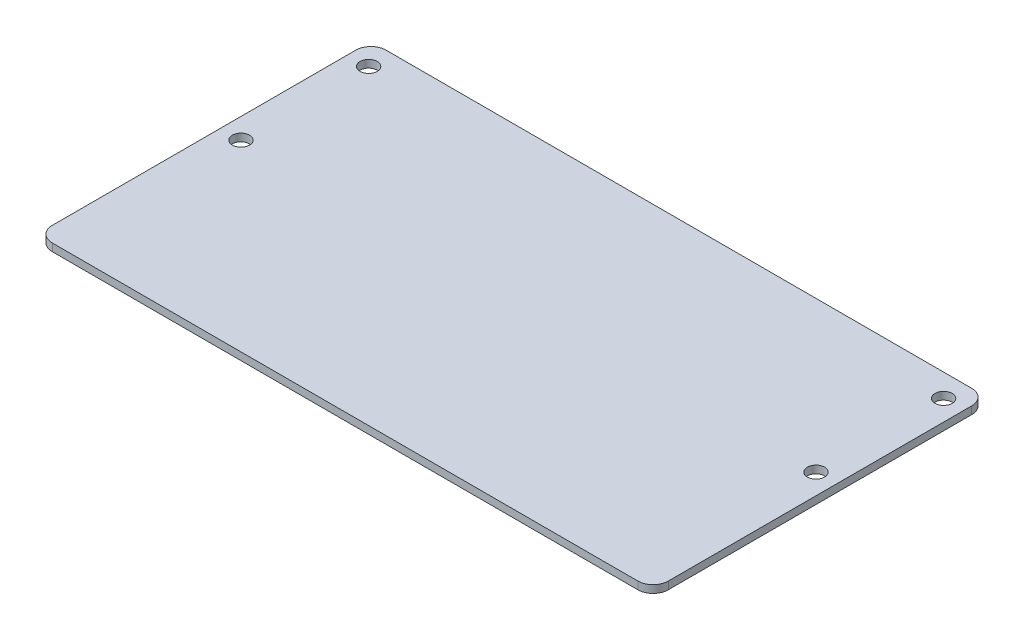
ISO-10303-21;
HEADER;
FILE_DESCRIPTION(('STEP AP214'),'2;1');
FILE_NAME('part.step','',(''),(''),'','','');
FILE_SCHEMA(('AUTOMOTIVE_DESIGN { 1 0 10303 214 1 1 1 1 }'));
ENDSEC;
DATA;
#1=APPLICATION_CONTEXT('core data for automotive mechanical design processes');
#2=APPLICATION_PROTOCOL_DEFINITION('international standard','automotive_design',2000,#1);
#3=PRODUCT_CONTEXT('',#1,'mechanical');
#4=PRODUCT('Part','Part','',(#3));
#5=PRODUCT_RELATED_PRODUCT_CATEGORY('part','',(#4));
#6=PRODUCT_DEFINITION_FORMATION('','',#4);
#7=PRODUCT_DEFINITION_CONTEXT('part definition',#1,'design');
#8=PRODUCT_DEFINITION('design','',#6,#7);
#9=PRODUCT_DEFINITION_SHAPE('','',#8);
#10=(LENGTH_UNIT() NAMED_UNIT(*) SI_UNIT(.MILLI.,.METRE.));
#11=(NAMED_UNIT(*) PLANE_ANGLE_UNIT() SI_UNIT($,.RADIAN.));
#12=(NAMED_UNIT(*) SI_UNIT($,.STERADIAN.) SOLID_ANGLE_UNIT());
#13=UNCERTAINTY_MEASURE_WITH_UNIT(LENGTH_MEASURE(1.E-05),#10,'distance_accuracy_value','');
#14=(GEOMETRIC_REPRESENTATION_CONTEXT(3) GLOBAL_UNCERTAINTY_ASSIGNED_CONTEXT((#13)) GLOBAL_UNIT_ASSIGNED_CONTEXT((#10,
#11,#12)) REPRESENTATION_CONTEXT('',''));
#15=CARTESIAN_POINT('',(0.,0.,0.));
#16=DIRECTION('',(0.,0.,1.));
#17=DIRECTION('',(1.,0.,0.));
#18=AXIS2_PLACEMENT_3D('',#15,#16,#17);
#19=CARTESIAN_POINT('',(60.8,1.5,-32.95));
#20=DIRECTION('',(-1.,0.,0.));
#21=DIRECTION('',(0.,0.,1.));
#22=AXIS2_PLACEMENT_3D('',#19,#20,#21);
#23=PLANE('',#22);
#24=DIRECTION('',(0.,0.,-1.));
#25=VECTOR('',#24,1.);
#26=CARTESIAN_POINT('',(60.8,1.5,-32.95));
#27=LINE('',#26,#25);
#28=CARTESIAN_POINT('',(60.8,1.5,29.95));
#29=VERTEX_POINT('',#28);
#30=CARTESIAN_POINT('',(60.8,1.5,-29.95));
#31=VERTEX_POINT('',#30);
#32=EDGE_CURVE('E121',#29,#31,#27,.T.);
#33=ORIENTED_EDGE('',*,*,#32,.F.);
#34=DIRECTION('',(0.,-1.,0.));
#35=VECTOR('',#34,1.);
#36=CARTESIAN_POINT('',(60.8,1.5,29.95));
#37=LINE('',#36,#35);
#38=CARTESIAN_POINT('',(60.8,0.,29.95));
#39=VERTEX_POINT('',#38);
#40=EDGE_CURVE('E106',#29,#39,#37,.T.);
#41=ORIENTED_EDGE('',*,*,#40,.T.);
#42=DIRECTION('',(0.,0.,-1.));
#43=VECTOR('',#42,1.);
#44=CARTESIAN_POINT('',(60.8,0.,-32.95));
#45=LINE('',#44,#43);
#46=CARTESIAN_POINT('',(60.8,0.,-29.95));
#47=VERTEX_POINT('',#46);
#48=EDGE_CURVE('E118',#39,#47,#45,.T.);
#49=ORIENTED_EDGE('',*,*,#48,.T.);
#50=DIRECTION('',(0.,-1.,0.));
#51=VECTOR('',#50,1.);
#52=CARTESIAN_POINT('',(60.8,1.5,-29.95));
#53=LINE('',#52,#51);
#54=EDGE_CURVE('E123',#47,#31,#53,.F.);
#55=ORIENTED_EDGE('',*,*,#54,.T.);
#56=EDGE_LOOP('',(#33,#41,#49,#55));
#57=FACE_BOUND('',#56,.T.);
#58=ADVANCED_FACE('F36',(#57),#23,.F.);
#59=CARTESIAN_POINT('',(-60.8,1.5,-32.95));
#60=DIRECTION('',(0.,0.,1.));
#61=DIRECTION('',(1.,0.,0.));
#62=AXIS2_PLACEMENT_3D('',#59,#60,#61);
#63=PLANE('',#62);
#64=DIRECTION('',(-1.,0.,0.));
#65=VECTOR('',#64,1.);
#66=CARTESIAN_POINT('',(-60.8,1.5,-32.95));
#67=LINE('',#66,#65);
#68=CARTESIAN_POINT('',(57.8,1.5,-32.95));
#69=VERTEX_POINT('',#68);
#70=CARTESIAN_POINT('',(-57.8,1.5,-32.95));
#71=VERTEX_POINT('',#70);
#72=EDGE_CURVE('E167',#69,#71,#67,.T.);
#73=ORIENTED_EDGE('',*,*,#72,.F.);
#74=DIRECTION('',(0.,-1.,0.));
#75=VECTOR('',#74,1.);
#76=CARTESIAN_POINT('',(57.8,1.5,-32.95));
#77=LINE('',#76,#75);
#78=CARTESIAN_POINT('',(57.8,0.,-32.95));
#79=VERTEX_POINT('',#78);
#80=EDGE_CURVE('E160',#69,#79,#77,.T.);
#81=ORIENTED_EDGE('',*,*,#80,.T.);
#82=DIRECTION('',(-1.,0.,0.));
#83=VECTOR('',#82,1.);
#84=CARTESIAN_POINT('',(-60.8,0.,-32.95));
#85=LINE('',#84,#83);
#86=CARTESIAN_POINT('',(-57.8,0.,-32.95));
#87=VERTEX_POINT('',#86);
#88=EDGE_CURVE('E127',#79,#87,#85,.T.);
#89=ORIENTED_EDGE('',*,*,#88,.T.);
#90=DIRECTION('',(0.,-1.,0.));
#91=VECTOR('',#90,1.);
#92=CARTESIAN_POINT('',(-57.8,1.5,-32.95));
#93=LINE('',#92,#91);
#94=EDGE_CURVE('E158',#87,#71,#93,.F.);
#95=ORIENTED_EDGE('',*,*,#94,.T.);
#96=EDGE_LOOP('',(#73,#81,#89,#95));
#97=FACE_BOUND('',#96,.T.);
#98=ADVANCED_FACE('F165',(#97),#63,.F.);
#99=CARTESIAN_POINT('',(-60.8,1.5,-32.95));
#100=DIRECTION('',(1.,0.,0.));
#101=DIRECTION('',(0.,0.,-1.));
#102=AXIS2_PLACEMENT_3D('',#99,#100,#101);
#103=PLANE('',#102);
#104=DIRECTION('',(0.,0.,1.));
#105=VECTOR('',#104,1.);
#106=CARTESIAN_POINT('',(-60.8,1.5,-32.95));
#107=LINE('',#106,#105);
#108=CARTESIAN_POINT('',(-60.8,1.5,-29.95));
#109=VERTEX_POINT('',#108);
#110=CARTESIAN_POINT('',(-60.8,1.5,29.95));
#111=VERTEX_POINT('',#110);
#112=EDGE_CURVE('E175',#109,#111,#107,.T.);
#113=ORIENTED_EDGE('',*,*,#112,.F.);
#114=DIRECTION('',(0.,-1.,0.));
#115=VECTOR('',#114,1.);
#116=CARTESIAN_POINT('',(-60.8,1.5,-29.95));
#117=LINE('',#116,#115);
#118=CARTESIAN_POINT('',(-60.8,0.,-29.95));
#119=VERTEX_POINT('',#118);
#120=EDGE_CURVE('E11',#109,#119,#117,.T.);
#121=ORIENTED_EDGE('',*,*,#120,.T.);
#122=DIRECTION('',(0.,0.,1.));
#123=VECTOR('',#122,1.);
#124=CARTESIAN_POINT('',(-60.8,0.,-32.95));
#125=LINE('',#124,#123);
#126=CARTESIAN_POINT('',(-60.8,0.,29.95));
#127=VERTEX_POINT('',#126);
#128=EDGE_CURVE('E131',#119,#127,#125,.T.);
#129=ORIENTED_EDGE('',*,*,#128,.T.);
#130=DIRECTION('',(0.,-1.,0.));
#131=VECTOR('',#130,1.);
#132=CARTESIAN_POINT('',(-60.8,1.5,29.95));
#133=LINE('',#132,#131);
#134=EDGE_CURVE('E44',#127,#111,#133,.F.);
#135=ORIENTED_EDGE('',*,*,#134,.T.);
#136=EDGE_LOOP('',(#113,#121,#129,#135));
#137=FACE_BOUND('',#136,.T.);
#138=ADVANCED_FACE('F174',(#137),#103,.F.);
#139=CARTESIAN_POINT('',(-60.8,1.5,32.95));
#140=DIRECTION('',(0.,0.,-1.));
#141=DIRECTION('',(-1.,0.,0.));
#142=AXIS2_PLACEMENT_3D('',#139,#140,#141);
#143=PLANE('',#142);
#144=DIRECTION('',(1.,0.,0.));
#145=VECTOR('',#144,1.);
#146=CARTESIAN_POINT('',(-60.8,0.,32.95));
#147=LINE('',#146,#145);
#148=CARTESIAN_POINT('',(-57.8,0.,32.95));
#149=VERTEX_POINT('',#148);
#150=CARTESIAN_POINT('',(57.8,0.,32.95));
#151=VERTEX_POINT('',#150);
#152=EDGE_CURVE('E141',#149,#151,#147,.T.);
#153=ORIENTED_EDGE('',*,*,#152,.T.);
#154=DIRECTION('',(0.,-1.,0.));
#155=VECTOR('',#154,1.);
#156=CARTESIAN_POINT('',(57.8,1.5,32.95));
#157=LINE('',#156,#155);
#158=CARTESIAN_POINT('',(57.8,1.5,32.95));
#159=VERTEX_POINT('',#158);
#160=EDGE_CURVE('E107',#151,#159,#157,.F.);
#161=ORIENTED_EDGE('',*,*,#160,.T.);
#162=DIRECTION('',(1.,0.,0.));
#163=VECTOR('',#162,1.);
#164=CARTESIAN_POINT('',(-60.8,1.5,32.95));
#165=LINE('',#164,#163);
#166=CARTESIAN_POINT('',(-57.8,1.5,32.95));
#167=VERTEX_POINT('',#166);
#168=EDGE_CURVE('E137',#167,#159,#165,.T.);
#169=ORIENTED_EDGE('',*,*,#168,.F.);
#170=DIRECTION('',(0.,-1.,0.));
#171=VECTOR('',#170,1.);
#172=CARTESIAN_POINT('',(-57.8,1.5,32.95));
#173=LINE('',#172,#171);
#174=EDGE_CURVE('E112',#167,#149,#173,.T.);
#175=ORIENTED_EDGE('',*,*,#174,.T.);
#176=EDGE_LOOP('',(#153,#161,#169,#175));
#177=FACE_BOUND('',#176,.T.);
#178=ADVANCED_FACE('F215',(#177),#143,.F.);
#179=CARTESIAN_POINT('',(0.,1.5,0.));
#180=DIRECTION('',(0.,1.,0.));
#181=DIRECTION('',(0.,0.,1.));
#182=AXIS2_PLACEMENT_3D('',#179,#180,#181);
#183=PLANE('',#182);
#184=CARTESIAN_POINT('',(-56.75,1.5,-3.25000000000001));
#185=DIRECTION('',(0.,1.,0.));
#186=DIRECTION('',(0.,0.,1.));
#187=AXIS2_PLACEMENT_3D('',#184,#185,#186);
#188=CIRCLE('',#187,1.7);
#189=CARTESIAN_POINT('',(-56.75,1.5,-1.55000000000001));
#190=VERTEX_POINT('',#189);
#191=EDGE_CURVE('E191',#190,#190,#188,.T.);
#192=ORIENTED_EDGE('',*,*,#191,.F.);
#193=EDGE_LOOP('',(#192));
#194=FACE_BOUND('',#193,.T.);
#195=CARTESIAN_POINT('',(56.75,1.5,-28.45));
#196=DIRECTION('',(0.,1.,0.));
#197=DIRECTION('',(0.,0.,1.));
#198=AXIS2_PLACEMENT_3D('',#195,#196,#197);
#199=CIRCLE('',#198,1.7);
#200=CARTESIAN_POINT('',(56.75,1.5,-26.75));
#201=VERTEX_POINT('',#200);
#202=EDGE_CURVE('E184',#201,#201,#199,.T.);
#203=ORIENTED_EDGE('',*,*,#202,.F.);
#204=EDGE_LOOP('',(#203));
#205=FACE_BOUND('',#204,.T.);
#206=CARTESIAN_POINT('',(56.75,1.5,-3.25000000000002));
#207=DIRECTION('',(0.,1.,0.));
#208=DIRECTION('',(0.,0.,1.));
#209=AXIS2_PLACEMENT_3D('',#206,#207,#208);
#210=CIRCLE('',#209,1.7);
#211=CARTESIAN_POINT('',(56.75,1.5,-1.55000000000002));
#212=VERTEX_POINT('',#211);
#213=EDGE_CURVE('E196',#212,#212,#210,.T.);
#214=ORIENTED_EDGE('',*,*,#213,.F.);
#215=EDGE_LOOP('',(#214));
#216=FACE_BOUND('',#215,.T.);
#217=CARTESIAN_POINT('',(-56.75,1.5,-28.45));
#218=DIRECTION('',(0.,1.,0.));
#219=DIRECTION('',(0.,0.,1.));
#220=AXIS2_PLACEMENT_3D('',#217,#218,#219);
#221=CIRCLE('',#220,1.7);
#222=CARTESIAN_POINT('',(-56.75,1.5,-26.75));
#223=VERTEX_POINT('',#222);
#224=EDGE_CURVE('E134',#223,#223,#221,.T.);
#225=ORIENTED_EDGE('',*,*,#224,.F.);
#226=EDGE_LOOP('',(#225));
#227=FACE_BOUND('',#226,.T.);
#228=ORIENTED_EDGE('',*,*,#168,.T.);
#229=CARTESIAN_POINT('',(57.8,1.5,29.95));
#230=DIRECTION('',(0.,1.,0.));
#231=DIRECTION('',(0.,0.,1.));
#232=AXIS2_PLACEMENT_3D('',#229,#230,#231);
#233=CIRCLE('',#232,3.);
#234=EDGE_CURVE('E156',#159,#29,#233,.T.);
#235=ORIENTED_EDGE('',*,*,#234,.T.);
#236=ORIENTED_EDGE('',*,*,#32,.T.);
#237=CARTESIAN_POINT('',(57.8,1.5,-29.95));
#238=DIRECTION('',(0.,1.,0.));
#239=DIRECTION('',(0.,0.,1.));
#240=AXIS2_PLACEMENT_3D('',#237,#238,#239);
#241=CIRCLE('',#240,3.);
#242=EDGE_CURVE('E154',#31,#69,#241,.T.);
#243=ORIENTED_EDGE('',*,*,#242,.T.);
#244=ORIENTED_EDGE('',*,*,#72,.T.);
#245=CARTESIAN_POINT('',(-57.8,1.5,-29.95));
#246=DIRECTION('',(0.,1.,0.));
#247=DIRECTION('',(0.,0.,1.));
#248=AXIS2_PLACEMENT_3D('',#245,#246,#247);
#249=CIRCLE('',#248,3.);
#250=EDGE_CURVE('E57',#71,#109,#249,.T.);
#251=ORIENTED_EDGE('',*,*,#250,.T.);
#252=ORIENTED_EDGE('',*,*,#112,.T.);
#253=CARTESIAN_POINT('',(-57.8,1.5,29.95));
#254=DIRECTION('',(0.,1.,0.));
#255=DIRECTION('',(0.,0.,1.));
#256=AXIS2_PLACEMENT_3D('',#253,#254,#255);
#257=CIRCLE('',#256,3.);
#258=EDGE_CURVE('E151',#111,#167,#257,.T.);
#259=ORIENTED_EDGE('',*,*,#258,.T.);
#260=EDGE_LOOP('',(#228,#235,#236,#243,#244,#251,#252,#259));
#261=FACE_BOUND('',#260,.T.);
#262=ADVANCED_FACE('F212',(#194,#205,#216,#227,#261),#183,.T.);
#263=CARTESIAN_POINT('',(0.,0.,0.));
#264=DIRECTION('',(0.,1.,0.));
#265=DIRECTION('',(0.,0.,1.));
#266=AXIS2_PLACEMENT_3D('',#263,#264,#265);
#267=PLANE('',#266);
#268=CARTESIAN_POINT('',(-56.75,0.,-3.25000000000001));
#269=DIRECTION('',(0.,1.,0.));
#270=DIRECTION('',(0.,0.,1.));
#271=AXIS2_PLACEMENT_3D('',#268,#269,#270);
#272=CIRCLE('',#271,1.7);
#273=CARTESIAN_POINT('',(-56.75,0.,-1.55000000000001));
#274=VERTEX_POINT('',#273);
#275=EDGE_CURVE('E182',#274,#274,#272,.T.);
#276=ORIENTED_EDGE('',*,*,#275,.T.);
#277=EDGE_LOOP('',(#276));
#278=FACE_BOUND('',#277,.T.);
#279=CARTESIAN_POINT('',(56.75,0.,-28.45));
#280=DIRECTION('',(0.,1.,0.));
#281=DIRECTION('',(0.,0.,1.));
#282=AXIS2_PLACEMENT_3D('',#279,#280,#281);
#283=CIRCLE('',#282,1.7);
#284=CARTESIAN_POINT('',(56.75,0.,-26.75));
#285=VERTEX_POINT('',#284);
#286=EDGE_CURVE('E187',#285,#285,#283,.T.);
#287=ORIENTED_EDGE('',*,*,#286,.T.);
#288=EDGE_LOOP('',(#287));
#289=FACE_BOUND('',#288,.T.);
#290=CARTESIAN_POINT('',(56.75,0.,-3.25000000000002));
#291=DIRECTION('',(0.,1.,0.));
#292=DIRECTION('',(0.,0.,1.));
#293=AXIS2_PLACEMENT_3D('',#290,#291,#292);
#294=CIRCLE('',#293,1.7);
#295=CARTESIAN_POINT('',(56.75,0.,-1.55000000000002));
#296=VERTEX_POINT('',#295);
#297=EDGE_CURVE('E188',#296,#296,#294,.T.);
#298=ORIENTED_EDGE('',*,*,#297,.T.);
#299=EDGE_LOOP('',(#298));
#300=FACE_BOUND('',#299,.T.);
#301=CARTESIAN_POINT('',(-56.75,0.,-28.45));
#302=DIRECTION('',(0.,1.,0.));
#303=DIRECTION('',(0.,0.,1.));
#304=AXIS2_PLACEMENT_3D('',#301,#302,#303);
#305=CIRCLE('',#304,1.7);
#306=CARTESIAN_POINT('',(-56.75,0.,-26.75));
#307=VERTEX_POINT('',#306);
#308=EDGE_CURVE('E128',#307,#307,#305,.T.);
#309=ORIENTED_EDGE('',*,*,#308,.T.);
#310=EDGE_LOOP('',(#309));
#311=FACE_BOUND('',#310,.T.);
#312=ORIENTED_EDGE('',*,*,#48,.F.);
#313=CARTESIAN_POINT('',(57.8,0.,29.95));
#314=DIRECTION('',(0.,1.,0.));
#315=DIRECTION('',(0.,0.,1.));
#316=AXIS2_PLACEMENT_3D('',#313,#314,#315);
#317=CIRCLE('',#316,3.);
#318=EDGE_CURVE('E102',#39,#151,#317,.F.);
#319=ORIENTED_EDGE('',*,*,#318,.T.);
#320=ORIENTED_EDGE('',*,*,#152,.F.);
#321=CARTESIAN_POINT('',(-57.8,0.,29.95));
#322=DIRECTION('',(0.,1.,0.));
#323=DIRECTION('',(0.,0.,1.));
#324=AXIS2_PLACEMENT_3D('',#321,#322,#323);
#325=CIRCLE('',#324,3.);
#326=EDGE_CURVE('E122',#149,#127,#325,.F.);
#327=ORIENTED_EDGE('',*,*,#326,.T.);
#328=ORIENTED_EDGE('',*,*,#128,.F.);
#329=CARTESIAN_POINT('',(-57.8,0.,-29.95));
#330=DIRECTION('',(0.,1.,0.));
#331=DIRECTION('',(0.,0.,1.));
#332=AXIS2_PLACEMENT_3D('',#329,#330,#331);
#333=CIRCLE('',#332,3.);
#334=EDGE_CURVE('E145',#119,#87,#333,.F.);
#335=ORIENTED_EDGE('',*,*,#334,.T.);
#336=ORIENTED_EDGE('',*,*,#88,.F.);
#337=CARTESIAN_POINT('',(57.8,0.,-29.95));
#338=DIRECTION('',(0.,1.,0.));
#339=DIRECTION('',(0.,0.,1.));
#340=AXIS2_PLACEMENT_3D('',#337,#338,#339);
#341=CIRCLE('',#340,3.);
#342=EDGE_CURVE('E113',#79,#47,#341,.F.);
#343=ORIENTED_EDGE('',*,*,#342,.T.);
#344=EDGE_LOOP('',(#312,#319,#320,#327,#328,#335,#336,#343));
#345=FACE_BOUND('',#344,.T.);
#346=ADVANCED_FACE('F125',(#278,#289,#300,#311,#345),#267,.F.);
#347=CARTESIAN_POINT('',(57.8,1.5,29.95));
#348=DIRECTION('',(0.,-1.,0.));
#349=DIRECTION('',(0.,0.,-1.));
#350=AXIS2_PLACEMENT_3D('',#347,#348,#349);
#351=CYLINDRICAL_SURFACE('',#350,3.);
#352=ORIENTED_EDGE('',*,*,#234,.F.);
#353=ORIENTED_EDGE('',*,*,#160,.F.);
#354=ORIENTED_EDGE('',*,*,#318,.F.);
#355=ORIENTED_EDGE('',*,*,#40,.F.);
#356=EDGE_LOOP('',(#352,#353,#354,#355));
#357=FACE_BOUND('',#356,.T.);
#358=ADVANCED_FACE('F105',(#357),#351,.T.);
#359=CARTESIAN_POINT('',(57.8,1.5,-29.95));
#360=DIRECTION('',(0.,-1.,0.));
#361=DIRECTION('',(0.,0.,-1.));
#362=AXIS2_PLACEMENT_3D('',#359,#360,#361);
#363=CYLINDRICAL_SURFACE('',#362,3.);
#364=ORIENTED_EDGE('',*,*,#242,.F.);
#365=ORIENTED_EDGE('',*,*,#54,.F.);
#366=ORIENTED_EDGE('',*,*,#342,.F.);
#367=ORIENTED_EDGE('',*,*,#80,.F.);
#368=EDGE_LOOP('',(#364,#365,#366,#367));
#369=FACE_BOUND('',#368,.T.);
#370=ADVANCED_FACE('F230',(#369),#363,.T.);
#371=CARTESIAN_POINT('',(-57.8,1.5,-29.95));
#372=DIRECTION('',(0.,-1.,0.));
#373=DIRECTION('',(0.,0.,-1.));
#374=AXIS2_PLACEMENT_3D('',#371,#372,#373);
#375=CYLINDRICAL_SURFACE('',#374,3.);
#376=ORIENTED_EDGE('',*,*,#250,.F.);
#377=ORIENTED_EDGE('',*,*,#94,.F.);
#378=ORIENTED_EDGE('',*,*,#334,.F.);
#379=ORIENTED_EDGE('',*,*,#120,.F.);
#380=EDGE_LOOP('',(#376,#377,#378,#379));
#381=FACE_BOUND('',#380,.T.);
#382=ADVANCED_FACE('F173',(#381),#375,.T.);
#383=CARTESIAN_POINT('',(-57.8,1.5,29.95));
#384=DIRECTION('',(0.,-1.,0.));
#385=DIRECTION('',(0.,0.,-1.));
#386=AXIS2_PLACEMENT_3D('',#383,#384,#385);
#387=CYLINDRICAL_SURFACE('',#386,3.);
#388=ORIENTED_EDGE('',*,*,#258,.F.);
#389=ORIENTED_EDGE('',*,*,#134,.F.);
#390=ORIENTED_EDGE('',*,*,#326,.F.);
#391=ORIENTED_EDGE('',*,*,#174,.F.);
#392=EDGE_LOOP('',(#388,#389,#390,#391));
#393=FACE_BOUND('',#392,.T.);
#394=ADVANCED_FACE('F38',(#393),#387,.T.);
#395=CARTESIAN_POINT('',(-56.75,0.,-28.45));
#396=DIRECTION('',(0.,1.,0.));
#397=DIRECTION('',(0.,0.,1.));
#398=AXIS2_PLACEMENT_3D('',#395,#396,#397);
#399=CYLINDRICAL_SURFACE('',#398,1.7);
#400=ORIENTED_EDGE('',*,*,#308,.F.);
#401=EDGE_LOOP('',(#400));
#402=FACE_BOUND('',#401,.T.);
#403=ORIENTED_EDGE('',*,*,#224,.T.);
#404=EDGE_LOOP('',(#403));
#405=FACE_BOUND('',#404,.T.);
#406=ADVANCED_FACE('F208',(#402,#405),#399,.F.);
#407=CARTESIAN_POINT('',(56.75,0.,-3.25000000000002));
#408=DIRECTION('',(0.,1.,0.));
#409=DIRECTION('',(0.,0.,1.));
#410=AXIS2_PLACEMENT_3D('',#407,#408,#409);
#411=CYLINDRICAL_SURFACE('',#410,1.7);
#412=ORIENTED_EDGE('',*,*,#297,.F.);
#413=EDGE_LOOP('',(#412));
#414=FACE_BOUND('',#413,.T.);
#415=ORIENTED_EDGE('',*,*,#213,.T.);
#416=EDGE_LOOP('',(#415));
#417=FACE_BOUND('',#416,.T.);
#418=ADVANCED_FACE('F204',(#414,#417),#411,.F.);
#419=CARTESIAN_POINT('',(56.75,0.,-28.45));
#420=DIRECTION('',(0.,1.,0.));
#421=DIRECTION('',(0.,0.,1.));
#422=AXIS2_PLACEMENT_3D('',#419,#420,#421);
#423=CYLINDRICAL_SURFACE('',#422,1.7);
#424=ORIENTED_EDGE('',*,*,#286,.F.);
#425=EDGE_LOOP('',(#424));
#426=FACE_BOUND('',#425,.T.);
#427=ORIENTED_EDGE('',*,*,#202,.T.);
#428=EDGE_LOOP('',(#427));
#429=FACE_BOUND('',#428,.T.);
#430=ADVANCED_FACE('F207',(#426,#429),#423,.F.);
#431=CARTESIAN_POINT('',(-56.75,0.,-3.25000000000001));
#432=DIRECTION('',(0.,1.,0.));
#433=DIRECTION('',(0.,0.,1.));
#434=AXIS2_PLACEMENT_3D('',#431,#432,#433);
#435=CYLINDRICAL_SURFACE('',#434,1.7);
#436=ORIENTED_EDGE('',*,*,#275,.F.);
#437=EDGE_LOOP('',(#436));
#438=FACE_BOUND('',#437,.T.);
#439=ORIENTED_EDGE('',*,*,#191,.T.);
#440=EDGE_LOOP('',(#439));
#441=FACE_BOUND('',#440,.T.);
#442=ADVANCED_FACE('F295',(#438,#441),#435,.F.);
#443=CLOSED_SHELL('',(#58,#98,#138,#178,#262,#346,#358,#370,#382,#394,#406,#418,#430,#442));
#444=MANIFOLD_SOLID_BREP('B2',#443);
#445=ADVANCED_BREP_SHAPE_REPRESENTATION('',(#18,#444),#14);
#446=SHAPE_DEFINITION_REPRESENTATION(#9,#445);
ENDSEC;
END-ISO-10303-21;
